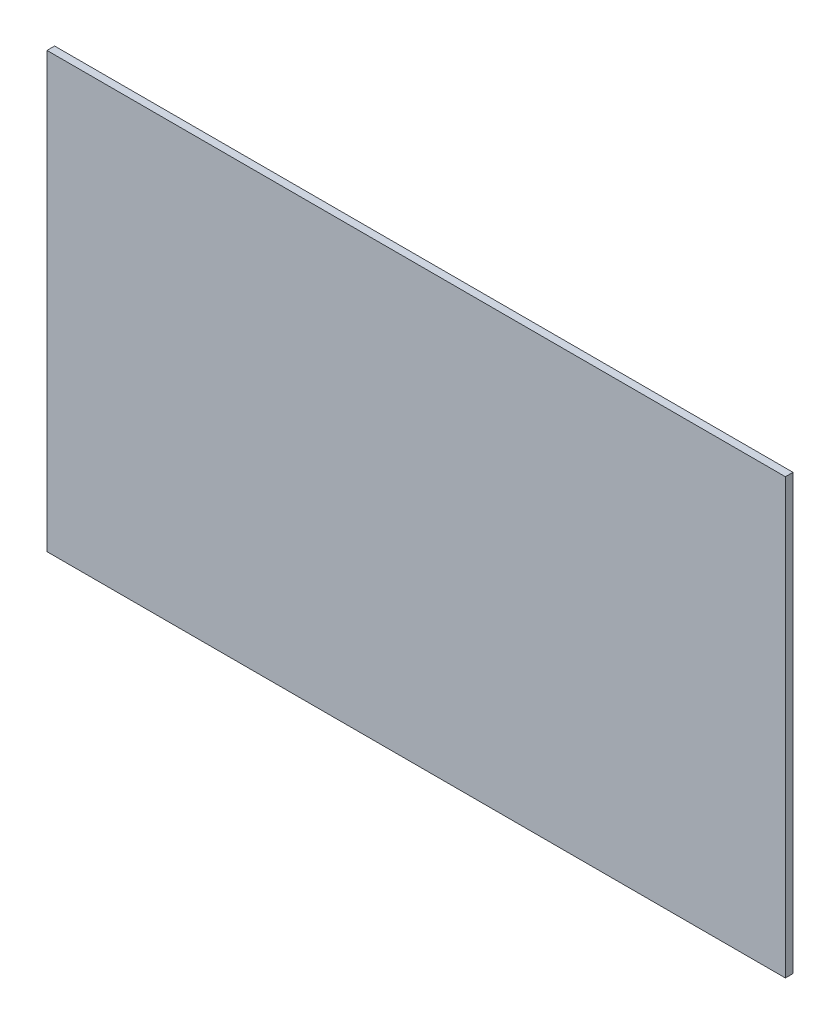
ISO-10303-21;
HEADER;
FILE_DESCRIPTION(('STEP AP214'),'2;1');
FILE_NAME('part.step','',(''),(''),'','','');
FILE_SCHEMA(('AUTOMOTIVE_DESIGN { 1 0 10303 214 1 1 1 1 }'));
ENDSEC;
DATA;
#1=APPLICATION_CONTEXT('core data for automotive mechanical design processes');
#2=APPLICATION_PROTOCOL_DEFINITION('international standard','automotive_design',2000,#1);
#3=PRODUCT_CONTEXT('',#1,'mechanical');
#4=PRODUCT('Part','Part','',(#3));
#5=PRODUCT_RELATED_PRODUCT_CATEGORY('part','',(#4));
#6=PRODUCT_DEFINITION_FORMATION('','',#4);
#7=PRODUCT_DEFINITION_CONTEXT('part definition',#1,'design');
#8=PRODUCT_DEFINITION('design','',#6,#7);
#9=PRODUCT_DEFINITION_SHAPE('','',#8);
#10=(LENGTH_UNIT() NAMED_UNIT(*) SI_UNIT(.MILLI.,.METRE.));
#11=(NAMED_UNIT(*) PLANE_ANGLE_UNIT() SI_UNIT($,.RADIAN.));
#12=(NAMED_UNIT(*) SI_UNIT($,.STERADIAN.) SOLID_ANGLE_UNIT());
#13=UNCERTAINTY_MEASURE_WITH_UNIT(LENGTH_MEASURE(1.E-05),#10,'distance_accuracy_value','');
#14=(GEOMETRIC_REPRESENTATION_CONTEXT(3) GLOBAL_UNCERTAINTY_ASSIGNED_CONTEXT((#13)) GLOBAL_UNIT_ASSIGNED_CONTEXT((#10,
#11,#12)) REPRESENTATION_CONTEXT('',''));
#15=CARTESIAN_POINT('',(0.,0.,0.));
#16=DIRECTION('',(0.,0.,1.));
#17=DIRECTION('',(1.,0.,0.));
#18=AXIS2_PLACEMENT_3D('',#15,#16,#17);
#19=CARTESIAN_POINT('',(-0.851,0.,0.));
#20=DIRECTION('',(0.,0.,1.));
#21=DIRECTION('',(1.,0.,0.));
#22=AXIS2_PLACEMENT_3D('',#19,#20,#21);
#23=PLANE('',#22);
#24=DIRECTION('',(1.,0.,0.));
#25=VECTOR('',#24,1.);
#26=CARTESIAN_POINT('',(3.988,2.845,0.));
#27=LINE('',#26,#25);
#28=CARTESIAN_POINT('',(3.988,2.845,0.));
#29=VERTEX_POINT('',#28);
#30=CARTESIAN_POINT('',(-5.69,2.845,0.));
#31=VERTEX_POINT('',#30);
#32=EDGE_CURVE('E78',#29,#31,#27,.F.);
#33=ORIENTED_EDGE('',*,*,#32,.F.);
#34=DIRECTION('',(0.,1.,0.));
#35=VECTOR('',#34,1.);
#36=CARTESIAN_POINT('',(3.988,-2.845,0.));
#37=LINE('',#36,#35);
#38=CARTESIAN_POINT('',(3.988,-2.845,0.));
#39=VERTEX_POINT('',#38);
#40=EDGE_CURVE('E54',#39,#29,#37,.T.);
#41=ORIENTED_EDGE('',*,*,#40,.F.);
#42=DIRECTION('',(1.,0.,0.));
#43=VECTOR('',#42,1.);
#44=CARTESIAN_POINT('',(-5.69,-2.845,0.));
#45=LINE('',#44,#43);
#46=CARTESIAN_POINT('',(-5.69,-2.845,0.));
#47=VERTEX_POINT('',#46);
#48=EDGE_CURVE('E56',#47,#39,#45,.T.);
#49=ORIENTED_EDGE('',*,*,#48,.F.);
#50=DIRECTION('',(0.,1.,0.));
#51=VECTOR('',#50,1.);
#52=CARTESIAN_POINT('',(-5.69,2.845,0.));
#53=LINE('',#52,#51);
#54=EDGE_CURVE('E19',#31,#47,#53,.F.);
#55=ORIENTED_EDGE('',*,*,#54,.F.);
#56=EDGE_LOOP('',(#33,#41,#49,#55));
#57=FACE_BOUND('',#56,.T.);
#58=ADVANCED_FACE('F16',(#57),#23,.F.);
#59=CARTESIAN_POINT('',(-5.69,2.845,0.));
#60=DIRECTION('',(-1.,0.,0.));
#61=DIRECTION('',(0.,0.,1.));
#62=AXIS2_PLACEMENT_3D('',#59,#60,#61);
#63=PLANE('',#62);
#64=DIRECTION('',(0.,1.,0.));
#65=VECTOR('',#64,1.);
#66=CARTESIAN_POINT('',(-5.69,0.,0.1));
#67=LINE('',#66,#65);
#68=CARTESIAN_POINT('',(-5.69,2.845,0.1));
#69=VERTEX_POINT('',#68);
#70=CARTESIAN_POINT('',(-5.69,-2.845,0.1));
#71=VERTEX_POINT('',#70);
#72=EDGE_CURVE('E82',#69,#71,#67,.F.);
#73=ORIENTED_EDGE('',*,*,#72,.F.);
#74=DIRECTION('',(0.,0.,1.));
#75=VECTOR('',#74,1.);
#76=CARTESIAN_POINT('',(-5.69,2.845,0.));
#77=LINE('',#76,#75);
#78=EDGE_CURVE('E67',#31,#69,#77,.T.);
#79=ORIENTED_EDGE('',*,*,#78,.F.);
#80=ORIENTED_EDGE('',*,*,#54,.T.);
#81=DIRECTION('',(0.,0.,-1.));
#82=VECTOR('',#81,1.);
#83=CARTESIAN_POINT('',(-5.69,-2.845,0.));
#84=LINE('',#83,#82);
#85=EDGE_CURVE('E62',#71,#47,#84,.T.);
#86=ORIENTED_EDGE('',*,*,#85,.F.);
#87=EDGE_LOOP('',(#73,#79,#80,#86));
#88=FACE_BOUND('',#87,.T.);
#89=ADVANCED_FACE('F64',(#88),#63,.T.);
#90=CARTESIAN_POINT('',(-5.69,-2.845,0.));
#91=DIRECTION('',(0.,-1.,0.));
#92=DIRECTION('',(0.,0.,-1.));
#93=AXIS2_PLACEMENT_3D('',#90,#91,#92);
#94=PLANE('',#93);
#95=DIRECTION('',(1.,0.,0.));
#96=VECTOR('',#95,1.);
#97=CARTESIAN_POINT('',(-0.851,-2.845,0.1));
#98=LINE('',#97,#96);
#99=CARTESIAN_POINT('',(3.988,-2.845,0.1));
#100=VERTEX_POINT('',#99);
#101=EDGE_CURVE('E71',#71,#100,#98,.T.);
#102=ORIENTED_EDGE('',*,*,#101,.F.);
#103=ORIENTED_EDGE('',*,*,#85,.T.);
#104=ORIENTED_EDGE('',*,*,#48,.T.);
#105=DIRECTION('',(0.,0.,-1.));
#106=VECTOR('',#105,1.);
#107=CARTESIAN_POINT('',(3.988,-2.845,0.));
#108=LINE('',#107,#106);
#109=EDGE_CURVE('E74',#100,#39,#108,.T.);
#110=ORIENTED_EDGE('',*,*,#109,.F.);
#111=EDGE_LOOP('',(#102,#103,#104,#110));
#112=FACE_BOUND('',#111,.T.);
#113=ADVANCED_FACE('F69',(#112),#94,.T.);
#114=CARTESIAN_POINT('',(3.988,-2.845,0.));
#115=DIRECTION('',(1.,0.,0.));
#116=DIRECTION('',(0.,0.,-1.));
#117=AXIS2_PLACEMENT_3D('',#114,#115,#116);
#118=PLANE('',#117);
#119=DIRECTION('',(0.,1.,0.));
#120=VECTOR('',#119,1.);
#121=CARTESIAN_POINT('',(3.988,0.,0.1));
#122=LINE('',#121,#120);
#123=CARTESIAN_POINT('',(3.988,2.845,0.1));
#124=VERTEX_POINT('',#123);
#125=EDGE_CURVE('E25',#100,#124,#122,.T.);
#126=ORIENTED_EDGE('',*,*,#125,.F.);
#127=ORIENTED_EDGE('',*,*,#109,.T.);
#128=ORIENTED_EDGE('',*,*,#40,.T.);
#129=DIRECTION('',(0.,0.,1.));
#130=VECTOR('',#129,1.);
#131=CARTESIAN_POINT('',(3.988,2.845,0.));
#132=LINE('',#131,#130);
#133=EDGE_CURVE('E34',#124,#29,#132,.F.);
#134=ORIENTED_EDGE('',*,*,#133,.F.);
#135=EDGE_LOOP('',(#126,#127,#128,#134));
#136=FACE_BOUND('',#135,.T.);
#137=ADVANCED_FACE('F88',(#136),#118,.T.);
#138=CARTESIAN_POINT('',(3.988,2.845,0.));
#139=DIRECTION('',(0.,1.,0.));
#140=DIRECTION('',(0.,0.,1.));
#141=AXIS2_PLACEMENT_3D('',#138,#139,#140);
#142=PLANE('',#141);
#143=DIRECTION('',(1.,0.,0.));
#144=VECTOR('',#143,1.);
#145=CARTESIAN_POINT('',(-0.851,2.845,0.1));
#146=LINE('',#145,#144);
#147=EDGE_CURVE('E11',#124,#69,#146,.F.);
#148=ORIENTED_EDGE('',*,*,#147,.F.);
#149=ORIENTED_EDGE('',*,*,#133,.T.);
#150=ORIENTED_EDGE('',*,*,#32,.T.);
#151=ORIENTED_EDGE('',*,*,#78,.T.);
#152=EDGE_LOOP('',(#148,#149,#150,#151));
#153=FACE_BOUND('',#152,.T.);
#154=ADVANCED_FACE('F90',(#153),#142,.T.);
#155=CARTESIAN_POINT('',(-0.851,0.,0.1));
#156=DIRECTION('',(0.,0.,1.));
#157=DIRECTION('',(1.,0.,0.));
#158=AXIS2_PLACEMENT_3D('',#155,#156,#157);
#159=PLANE('',#158);
#160=ORIENTED_EDGE('',*,*,#125,.T.);
#161=ORIENTED_EDGE('',*,*,#147,.T.);
#162=ORIENTED_EDGE('',*,*,#72,.T.);
#163=ORIENTED_EDGE('',*,*,#101,.T.);
#164=EDGE_LOOP('',(#160,#161,#162,#163));
#165=FACE_BOUND('',#164,.T.);
#166=ADVANCED_FACE('F87',(#165),#159,.T.);
#167=CLOSED_SHELL('',(#58,#89,#113,#137,#154,#166));
#168=MANIFOLD_SOLID_BREP('B1',#167);
#169=ADVANCED_BREP_SHAPE_REPRESENTATION('',(#18,#168),#14);
#170=SHAPE_DEFINITION_REPRESENTATION(#9,#169);
ENDSEC;
END-ISO-10303-21;
